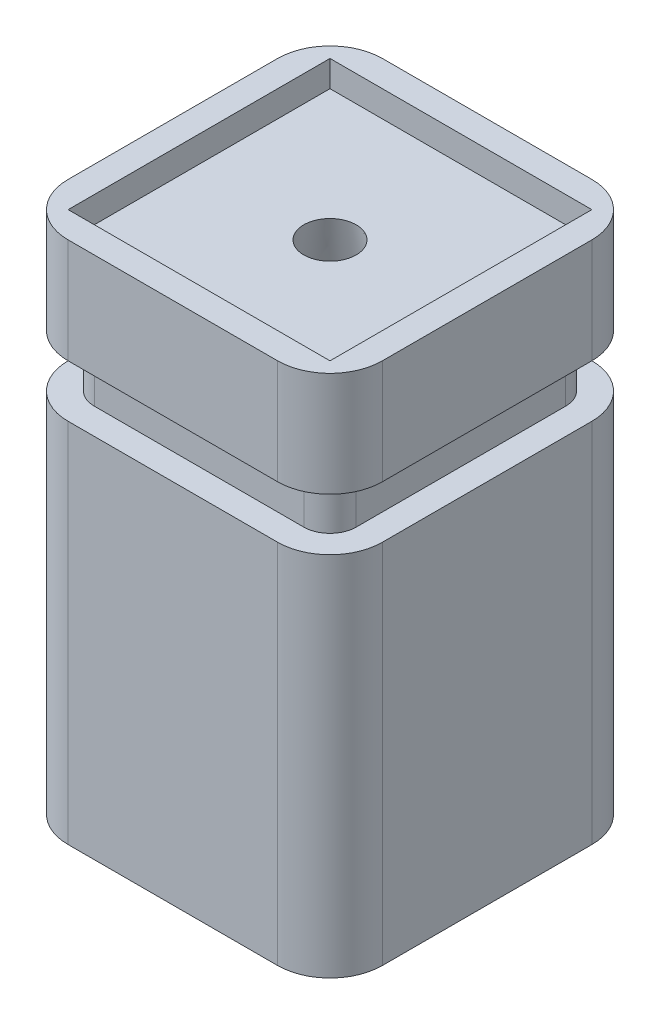
ISO-10303-21;
HEADER;
FILE_DESCRIPTION(('STEP AP214'),'2;1');
FILE_NAME('part.step','',(''),(''),'','','');
FILE_SCHEMA(('AUTOMOTIVE_DESIGN { 1 0 10303 214 1 1 1 1 }'));
ENDSEC;
DATA;
#1=APPLICATION_CONTEXT('core data for automotive mechanical design processes');
#2=APPLICATION_PROTOCOL_DEFINITION('international standard','automotive_design',2000,#1);
#3=PRODUCT_CONTEXT('',#1,'mechanical');
#4=PRODUCT('Part','Part','',(#3));
#5=PRODUCT_RELATED_PRODUCT_CATEGORY('part','',(#4));
#6=PRODUCT_DEFINITION_FORMATION('','',#4);
#7=PRODUCT_DEFINITION_CONTEXT('part definition',#1,'design');
#8=PRODUCT_DEFINITION('design','',#6,#7);
#9=PRODUCT_DEFINITION_SHAPE('','',#8);
#10=(LENGTH_UNIT() NAMED_UNIT(*) SI_UNIT(.MILLI.,.METRE.));
#11=(NAMED_UNIT(*) PLANE_ANGLE_UNIT() SI_UNIT($,.RADIAN.));
#12=(NAMED_UNIT(*) SI_UNIT($,.STERADIAN.) SOLID_ANGLE_UNIT());
#13=UNCERTAINTY_MEASURE_WITH_UNIT(LENGTH_MEASURE(1.E-05),#10,'distance_accuracy_value','');
#14=(GEOMETRIC_REPRESENTATION_CONTEXT(3) GLOBAL_UNCERTAINTY_ASSIGNED_CONTEXT((#13)) GLOBAL_UNIT_ASSIGNED_CONTEXT((#10,
#11,#12)) REPRESENTATION_CONTEXT('',''));
#15=CARTESIAN_POINT('',(0.,0.,0.));
#16=DIRECTION('',(0.,0.,1.));
#17=DIRECTION('',(1.,0.,0.));
#18=AXIS2_PLACEMENT_3D('',#15,#16,#17);
#19=CARTESIAN_POINT('',(15.,50.,15.));
#20=DIRECTION('',(-1.,0.,0.));
#21=DIRECTION('',(0.,0.,1.));
#22=AXIS2_PLACEMENT_3D('',#19,#20,#21);
#23=PLANE('',#22);
#24=DIRECTION('',(0.,0.,-1.));
#25=VECTOR('',#24,1.);
#26=CARTESIAN_POINT('',(15.,35.,15.));
#27=LINE('',#26,#25);
#28=CARTESIAN_POINT('',(15.,35.,10.));
#29=VERTEX_POINT('',#28);
#30=CARTESIAN_POINT('',(15.,35.,-9.99999999999999));
#31=VERTEX_POINT('',#30);
#32=EDGE_CURVE('E306',#29,#31,#27,.T.);
#33=ORIENTED_EDGE('',*,*,#32,.F.);
#34=DIRECTION('',(0.,-1.,0.));
#35=VECTOR('',#34,1.);
#36=CARTESIAN_POINT('',(15.,50.,10.));
#37=LINE('',#36,#35);
#38=CARTESIAN_POINT('',(15.,0.,10.));
#39=VERTEX_POINT('',#38);
#40=EDGE_CURVE('E405',#29,#39,#37,.T.);
#41=ORIENTED_EDGE('',*,*,#40,.T.);
#42=DIRECTION('',(0.,0.,-1.));
#43=VECTOR('',#42,1.);
#44=CARTESIAN_POINT('',(15.,0.,15.));
#45=LINE('',#44,#43);
#46=CARTESIAN_POINT('',(15.,0.,-10.));
#47=VERTEX_POINT('',#46);
#48=EDGE_CURVE('E359',#39,#47,#45,.T.);
#49=ORIENTED_EDGE('',*,*,#48,.T.);
#50=DIRECTION('',(0.,-1.,0.));
#51=VECTOR('',#50,1.);
#52=CARTESIAN_POINT('',(15.,50.,-10.));
#53=LINE('',#52,#51);
#54=EDGE_CURVE('E410',#47,#31,#53,.F.);
#55=ORIENTED_EDGE('',*,*,#54,.T.);
#56=EDGE_LOOP('',(#33,#41,#49,#55));
#57=FACE_BOUND('',#56,.T.);
#58=ADVANCED_FACE('F41',(#57),#23,.F.);
#59=CARTESIAN_POINT('',(-15.,50.,-15.));
#60=DIRECTION('',(0.,0.,1.));
#61=DIRECTION('',(1.,0.,0.));
#62=AXIS2_PLACEMENT_3D('',#59,#60,#61);
#63=PLANE('',#62);
#64=DIRECTION('',(-1.,0.,0.));
#65=VECTOR('',#64,1.);
#66=CARTESIAN_POINT('',(-15.,35.,-15.));
#67=LINE('',#66,#65);
#68=CARTESIAN_POINT('',(9.99999999999999,35.,-15.));
#69=VERTEX_POINT('',#68);
#70=CARTESIAN_POINT('',(-10.,35.,-15.));
#71=VERTEX_POINT('',#70);
#72=EDGE_CURVE('E304',#69,#71,#67,.T.);
#73=ORIENTED_EDGE('',*,*,#72,.F.);
#74=DIRECTION('',(0.,-1.,0.));
#75=VECTOR('',#74,1.);
#76=CARTESIAN_POINT('',(10.,50.,-15.));
#77=LINE('',#76,#75);
#78=CARTESIAN_POINT('',(10.,0.,-15.));
#79=VERTEX_POINT('',#78);
#80=EDGE_CURVE('E393',#69,#79,#77,.T.);
#81=ORIENTED_EDGE('',*,*,#80,.T.);
#82=DIRECTION('',(-1.,0.,0.));
#83=VECTOR('',#82,1.);
#84=CARTESIAN_POINT('',(-15.,0.,-15.));
#85=LINE('',#84,#83);
#86=CARTESIAN_POINT('',(-10.,0.,-15.));
#87=VERTEX_POINT('',#86);
#88=EDGE_CURVE('E382',#79,#87,#85,.T.);
#89=ORIENTED_EDGE('',*,*,#88,.T.);
#90=DIRECTION('',(0.,-1.,0.));
#91=VECTOR('',#90,1.);
#92=CARTESIAN_POINT('',(-10.,50.,-15.));
#93=LINE('',#92,#91);
#94=EDGE_CURVE('E390',#87,#71,#93,.F.);
#95=ORIENTED_EDGE('',*,*,#94,.T.);
#96=EDGE_LOOP('',(#73,#81,#89,#95));
#97=FACE_BOUND('',#96,.T.);
#98=ADVANCED_FACE('F470',(#97),#63,.F.);
#99=CARTESIAN_POINT('',(-15.,50.,15.));
#100=DIRECTION('',(1.,0.,0.));
#101=DIRECTION('',(0.,0.,-1.));
#102=AXIS2_PLACEMENT_3D('',#99,#100,#101);
#103=PLANE('',#102);
#104=DIRECTION('',(0.,0.,1.));
#105=VECTOR('',#104,1.);
#106=CARTESIAN_POINT('',(-15.,35.,15.));
#107=LINE('',#106,#105);
#108=CARTESIAN_POINT('',(-15.,35.,-9.99999999999999));
#109=VERTEX_POINT('',#108);
#110=CARTESIAN_POINT('',(-15.,35.,10.));
#111=VERTEX_POINT('',#110);
#112=EDGE_CURVE('E63',#109,#111,#107,.T.);
#113=ORIENTED_EDGE('',*,*,#112,.F.);
#114=DIRECTION('',(0.,-1.,0.));
#115=VECTOR('',#114,1.);
#116=CARTESIAN_POINT('',(-15.,50.,-10.));
#117=LINE('',#116,#115);
#118=CARTESIAN_POINT('',(-15.,0.,-10.));
#119=VERTEX_POINT('',#118);
#120=EDGE_CURVE('E433',#109,#119,#117,.T.);
#121=ORIENTED_EDGE('',*,*,#120,.T.);
#122=DIRECTION('',(0.,0.,1.));
#123=VECTOR('',#122,1.);
#124=CARTESIAN_POINT('',(-15.,0.,15.));
#125=LINE('',#124,#123);
#126=CARTESIAN_POINT('',(-15.,0.,10.));
#127=VERTEX_POINT('',#126);
#128=EDGE_CURVE('E385',#119,#127,#125,.T.);
#129=ORIENTED_EDGE('',*,*,#128,.T.);
#130=DIRECTION('',(0.,-1.,0.));
#131=VECTOR('',#130,1.);
#132=CARTESIAN_POINT('',(-15.,50.,10.));
#133=LINE('',#132,#131);
#134=EDGE_CURVE('E430',#127,#111,#133,.F.);
#135=ORIENTED_EDGE('',*,*,#134,.T.);
#136=EDGE_LOOP('',(#113,#121,#129,#135));
#137=FACE_BOUND('',#136,.T.);
#138=ADVANCED_FACE('F443',(#137),#103,.F.);
#139=CARTESIAN_POINT('',(-15.,50.,15.));
#140=DIRECTION('',(0.,0.,-1.));
#141=DIRECTION('',(-1.,0.,0.));
#142=AXIS2_PLACEMENT_3D('',#139,#140,#141);
#143=PLANE('',#142);
#144=DIRECTION('',(1.,0.,0.));
#145=VECTOR('',#144,1.);
#146=CARTESIAN_POINT('',(-15.,35.,15.));
#147=LINE('',#146,#145);
#148=CARTESIAN_POINT('',(-10.,35.,15.));
#149=VERTEX_POINT('',#148);
#150=CARTESIAN_POINT('',(9.99999999999999,35.,15.));
#151=VERTEX_POINT('',#150);
#152=EDGE_CURVE('E245',#149,#151,#147,.T.);
#153=ORIENTED_EDGE('',*,*,#152,.F.);
#154=DIRECTION('',(0.,-1.,0.));
#155=VECTOR('',#154,1.);
#156=CARTESIAN_POINT('',(-10.,50.,15.));
#157=LINE('',#156,#155);
#158=CARTESIAN_POINT('',(-10.,0.,15.));
#159=VERTEX_POINT('',#158);
#160=EDGE_CURVE('E421',#149,#159,#157,.T.);
#161=ORIENTED_EDGE('',*,*,#160,.T.);
#162=DIRECTION('',(1.,0.,0.));
#163=VECTOR('',#162,1.);
#164=CARTESIAN_POINT('',(-15.,0.,15.));
#165=LINE('',#164,#163);
#166=CARTESIAN_POINT('',(10.,0.,15.));
#167=VERTEX_POINT('',#166);
#168=EDGE_CURVE('E370',#159,#167,#165,.T.);
#169=ORIENTED_EDGE('',*,*,#168,.T.);
#170=DIRECTION('',(0.,-1.,0.));
#171=VECTOR('',#170,1.);
#172=CARTESIAN_POINT('',(10.,50.,15.));
#173=LINE('',#172,#171);
#174=EDGE_CURVE('E426',#167,#151,#173,.F.);
#175=ORIENTED_EDGE('',*,*,#174,.T.);
#176=EDGE_LOOP('',(#153,#161,#169,#175));
#177=FACE_BOUND('',#176,.T.);
#178=ADVANCED_FACE('F455',(#177),#143,.F.);
#179=CARTESIAN_POINT('',(10.,50.,-10.));
#180=DIRECTION('',(0.,-1.,0.));
#181=DIRECTION('',(0.,0.,-1.));
#182=AXIS2_PLACEMENT_3D('',#179,#180,#181);
#183=CYLINDRICAL_SURFACE('',#182,5.);
#184=ORIENTED_EDGE('',*,*,#80,.F.);
#185=CARTESIAN_POINT('',(10.,35.,-10.));
#186=DIRECTION('',(0.,1.,0.));
#187=DIRECTION('',(0.,0.,1.));
#188=AXIS2_PLACEMENT_3D('',#185,#186,#187);
#189=CIRCLE('',#188,5.);
#190=EDGE_CURVE('E308',#69,#31,#189,.F.);
#191=ORIENTED_EDGE('',*,*,#190,.T.);
#192=ORIENTED_EDGE('',*,*,#54,.F.);
#193=CARTESIAN_POINT('',(10.,0.,-10.));
#194=DIRECTION('',(0.,-1.,0.));
#195=DIRECTION('',(0.,0.,-1.));
#196=AXIS2_PLACEMENT_3D('',#193,#194,#195);
#197=CIRCLE('',#196,5.);
#198=EDGE_CURVE('E403',#79,#47,#197,.T.);
#199=ORIENTED_EDGE('',*,*,#198,.F.);
#200=EDGE_LOOP('',(#184,#191,#192,#199));
#201=FACE_BOUND('',#200,.T.);
#202=ADVANCED_FACE('F467',(#201),#183,.T.);
#203=CARTESIAN_POINT('',(10.,50.,10.));
#204=DIRECTION('',(0.,-1.,0.));
#205=DIRECTION('',(0.,0.,-1.));
#206=AXIS2_PLACEMENT_3D('',#203,#204,#205);
#207=CYLINDRICAL_SURFACE('',#206,5.);
#208=ORIENTED_EDGE('',*,*,#40,.F.);
#209=CARTESIAN_POINT('',(10.,35.,10.));
#210=DIRECTION('',(0.,1.,0.));
#211=DIRECTION('',(0.,0.,1.));
#212=AXIS2_PLACEMENT_3D('',#209,#210,#211);
#213=CIRCLE('',#212,5.);
#214=EDGE_CURVE('E301',#29,#151,#213,.F.);
#215=ORIENTED_EDGE('',*,*,#214,.T.);
#216=ORIENTED_EDGE('',*,*,#174,.F.);
#217=CARTESIAN_POINT('',(10.,0.,10.));
#218=DIRECTION('',(0.,-1.,0.));
#219=DIRECTION('',(0.,0.,-1.));
#220=AXIS2_PLACEMENT_3D('',#217,#218,#219);
#221=CIRCLE('',#220,5.);
#222=EDGE_CURVE('E401',#39,#167,#221,.T.);
#223=ORIENTED_EDGE('',*,*,#222,.F.);
#224=EDGE_LOOP('',(#208,#215,#216,#223));
#225=FACE_BOUND('',#224,.T.);
#226=ADVANCED_FACE('F458',(#225),#207,.T.);
#227=CARTESIAN_POINT('',(-10.,50.,-10.));
#228=DIRECTION('',(0.,-1.,0.));
#229=DIRECTION('',(0.,0.,-1.));
#230=AXIS2_PLACEMENT_3D('',#227,#228,#229);
#231=CYLINDRICAL_SURFACE('',#230,5.);
#232=ORIENTED_EDGE('',*,*,#120,.F.);
#233=CARTESIAN_POINT('',(-10.,35.,-10.));
#234=DIRECTION('',(0.,1.,0.));
#235=DIRECTION('',(0.,0.,1.));
#236=AXIS2_PLACEMENT_3D('',#233,#234,#235);
#237=CIRCLE('',#236,5.);
#238=EDGE_CURVE('E298',#109,#71,#237,.F.);
#239=ORIENTED_EDGE('',*,*,#238,.T.);
#240=ORIENTED_EDGE('',*,*,#94,.F.);
#241=CARTESIAN_POINT('',(-10.,0.,-10.));
#242=DIRECTION('',(0.,-1.,0.));
#243=DIRECTION('',(0.,0.,-1.));
#244=AXIS2_PLACEMENT_3D('',#241,#242,#243);
#245=CIRCLE('',#244,5.);
#246=EDGE_CURVE('E399',#119,#87,#245,.T.);
#247=ORIENTED_EDGE('',*,*,#246,.F.);
#248=EDGE_LOOP('',(#232,#239,#240,#247));
#249=FACE_BOUND('',#248,.T.);
#250=ADVANCED_FACE('F473',(#249),#231,.T.);
#251=CARTESIAN_POINT('',(-10.,50.,10.));
#252=DIRECTION('',(0.,-1.,0.));
#253=DIRECTION('',(0.,0.,-1.));
#254=AXIS2_PLACEMENT_3D('',#251,#252,#253);
#255=CYLINDRICAL_SURFACE('',#254,5.);
#256=ORIENTED_EDGE('',*,*,#160,.F.);
#257=CARTESIAN_POINT('',(-10.,35.,10.));
#258=DIRECTION('',(0.,1.,0.));
#259=DIRECTION('',(0.,0.,1.));
#260=AXIS2_PLACEMENT_3D('',#257,#258,#259);
#261=CIRCLE('',#260,5.);
#262=EDGE_CURVE('E49',#149,#111,#261,.F.);
#263=ORIENTED_EDGE('',*,*,#262,.T.);
#264=ORIENTED_EDGE('',*,*,#134,.F.);
#265=CARTESIAN_POINT('',(-10.,0.,10.));
#266=DIRECTION('',(0.,-1.,0.));
#267=DIRECTION('',(0.,0.,-1.));
#268=AXIS2_PLACEMENT_3D('',#265,#266,#267);
#269=CIRCLE('',#268,5.);
#270=EDGE_CURVE('E397',#159,#127,#269,.T.);
#271=ORIENTED_EDGE('',*,*,#270,.F.);
#272=EDGE_LOOP('',(#256,#263,#264,#271));
#273=FACE_BOUND('',#272,.T.);
#274=ADVANCED_FACE('F439',(#273),#255,.T.);
#275=CARTESIAN_POINT('',(0.,47.5,0.));
#276=DIRECTION('',(0.,-1.,0.));
#277=DIRECTION('',(0.,0.,-1.));
#278=AXIS2_PLACEMENT_3D('',#275,#276,#277);
#279=PLANE('',#278);
#280=DIRECTION('',(0.,0.,-1.));
#281=VECTOR('',#280,1.);
#282=CARTESIAN_POINT('',(12.5,47.5,12.5));
#283=LINE('',#282,#281);
#284=CARTESIAN_POINT('',(12.5,47.5,12.5));
#285=VERTEX_POINT('',#284);
#286=CARTESIAN_POINT('',(12.5,47.5,-12.5));
#287=VERTEX_POINT('',#286);
#288=EDGE_CURVE('E334',#285,#287,#283,.T.);
#289=ORIENTED_EDGE('',*,*,#288,.T.);
#290=DIRECTION('',(-1.,0.,0.));
#291=VECTOR('',#290,1.);
#292=CARTESIAN_POINT('',(-12.5,47.5,-12.5));
#293=LINE('',#292,#291);
#294=CARTESIAN_POINT('',(-12.5,47.5,-12.5));
#295=VERTEX_POINT('',#294);
#296=EDGE_CURVE('E337',#287,#295,#293,.T.);
#297=ORIENTED_EDGE('',*,*,#296,.T.);
#298=DIRECTION('',(0.,0.,1.));
#299=VECTOR('',#298,1.);
#300=CARTESIAN_POINT('',(-12.5,47.5,12.5));
#301=LINE('',#300,#299);
#302=CARTESIAN_POINT('',(-12.5,47.5,12.5));
#303=VERTEX_POINT('',#302);
#304=EDGE_CURVE('E341',#295,#303,#301,.T.);
#305=ORIENTED_EDGE('',*,*,#304,.T.);
#306=DIRECTION('',(1.,0.,0.));
#307=VECTOR('',#306,1.);
#308=CARTESIAN_POINT('',(-12.5,47.5,12.5));
#309=LINE('',#308,#307);
#310=EDGE_CURVE('E344',#303,#285,#309,.T.);
#311=ORIENTED_EDGE('',*,*,#310,.T.);
#312=EDGE_LOOP('',(#289,#297,#305,#311));
#313=FACE_BOUND('',#312,.T.);
#314=CARTESIAN_POINT('',(0.,47.5,0.));
#315=DIRECTION('',(0.,1.,0.));
#316=DIRECTION('',(0.,0.,1.));
#317=AXIS2_PLACEMENT_3D('',#314,#315,#316);
#318=CIRCLE('',#317,2.5);
#319=CARTESIAN_POINT('',(0.784484004687969,47.5,-2.37372804811097));
#320=VERTEX_POINT('',#319);
#321=EDGE_CURVE('E330',#320,#320,#318,.T.);
#322=ORIENTED_EDGE('',*,*,#321,.F.);
#323=EDGE_LOOP('',(#322));
#324=FACE_BOUND('',#323,.T.);
#325=ADVANCED_FACE('F480',(#313,#324),#279,.F.);
#326=CARTESIAN_POINT('',(15.,50.,10.));
#327=VERTEX_POINT('',#326);
#328=CARTESIAN_POINT('',(15.,40.,10.));
#329=VERTEX_POINT('',#328);
#330=EDGE_CURVE('E406',#327,#329,#37,.T.);
#331=ORIENTED_EDGE('',*,*,#330,.T.);
#332=DIRECTION('',(0.,0.,-1.));
#333=VECTOR('',#332,1.);
#334=CARTESIAN_POINT('',(15.,40.,15.));
#335=LINE('',#334,#333);
#336=CARTESIAN_POINT('',(15.,40.,-9.99999999999999));
#337=VERTEX_POINT('',#336);
#338=EDGE_CURVE('E322',#329,#337,#335,.T.);
#339=ORIENTED_EDGE('',*,*,#338,.T.);
#340=CARTESIAN_POINT('',(15.,50.,-10.));
#341=VERTEX_POINT('',#340);
#342=EDGE_CURVE('E409',#337,#341,#53,.F.);
#343=ORIENTED_EDGE('',*,*,#342,.T.);
#344=DIRECTION('',(0.,0.,-1.));
#345=VECTOR('',#344,1.);
#346=CARTESIAN_POINT('',(15.,50.,15.));
#347=LINE('',#346,#345);
#348=EDGE_CURVE('E366',#327,#341,#347,.T.);
#349=ORIENTED_EDGE('',*,*,#348,.F.);
#350=EDGE_LOOP('',(#331,#339,#343,#349));
#351=FACE_BOUND('',#350,.T.);
#352=ADVANCED_FACE('F487',(#351),#23,.F.);
#353=CARTESIAN_POINT('',(10.,50.,-15.));
#354=VERTEX_POINT('',#353);
#355=CARTESIAN_POINT('',(9.99999999999999,40.,-15.));
#356=VERTEX_POINT('',#355);
#357=EDGE_CURVE('E394',#354,#356,#77,.T.);
#358=ORIENTED_EDGE('',*,*,#357,.T.);
#359=DIRECTION('',(-1.,0.,0.));
#360=VECTOR('',#359,1.);
#361=CARTESIAN_POINT('',(-15.,40.,-15.));
#362=LINE('',#361,#360);
#363=CARTESIAN_POINT('',(-10.,40.,-15.));
#364=VERTEX_POINT('',#363);
#365=EDGE_CURVE('E319',#356,#364,#362,.T.);
#366=ORIENTED_EDGE('',*,*,#365,.T.);
#367=CARTESIAN_POINT('',(-10.,50.,-15.));
#368=VERTEX_POINT('',#367);
#369=EDGE_CURVE('E379',#364,#368,#93,.F.);
#370=ORIENTED_EDGE('',*,*,#369,.T.);
#371=DIRECTION('',(-1.,0.,0.));
#372=VECTOR('',#371,1.);
#373=CARTESIAN_POINT('',(-15.,50.,-15.));
#374=LINE('',#373,#372);
#375=EDGE_CURVE('E369',#354,#368,#374,.T.);
#376=ORIENTED_EDGE('',*,*,#375,.F.);
#377=EDGE_LOOP('',(#358,#366,#370,#376));
#378=FACE_BOUND('',#377,.T.);
#379=ADVANCED_FACE('F493',(#378),#63,.F.);
#380=CARTESIAN_POINT('',(-15.,50.,-10.));
#381=VERTEX_POINT('',#380);
#382=CARTESIAN_POINT('',(-15.,40.,-9.99999999999999));
#383=VERTEX_POINT('',#382);
#384=EDGE_CURVE('E434',#381,#383,#117,.T.);
#385=ORIENTED_EDGE('',*,*,#384,.T.);
#386=DIRECTION('',(0.,0.,1.));
#387=VECTOR('',#386,1.);
#388=CARTESIAN_POINT('',(-15.,40.,15.));
#389=LINE('',#388,#387);
#390=CARTESIAN_POINT('',(-15.,40.,10.));
#391=VERTEX_POINT('',#390);
#392=EDGE_CURVE('E312',#383,#391,#389,.T.);
#393=ORIENTED_EDGE('',*,*,#392,.T.);
#394=CARTESIAN_POINT('',(-15.,50.,10.));
#395=VERTEX_POINT('',#394);
#396=EDGE_CURVE('E429',#391,#395,#133,.F.);
#397=ORIENTED_EDGE('',*,*,#396,.T.);
#398=DIRECTION('',(0.,0.,1.));
#399=VECTOR('',#398,1.);
#400=CARTESIAN_POINT('',(-15.,50.,15.));
#401=LINE('',#400,#399);
#402=EDGE_CURVE('E373',#381,#395,#401,.T.);
#403=ORIENTED_EDGE('',*,*,#402,.F.);
#404=EDGE_LOOP('',(#385,#393,#397,#403));
#405=FACE_BOUND('',#404,.T.);
#406=ADVANCED_FACE('F500',(#405),#103,.F.);
#407=CARTESIAN_POINT('',(-10.,50.,15.));
#408=VERTEX_POINT('',#407);
#409=CARTESIAN_POINT('',(-10.,40.,15.));
#410=VERTEX_POINT('',#409);
#411=EDGE_CURVE('E422',#408,#410,#157,.T.);
#412=ORIENTED_EDGE('',*,*,#411,.T.);
#413=DIRECTION('',(1.,0.,0.));
#414=VECTOR('',#413,1.);
#415=CARTESIAN_POINT('',(-15.,40.,15.));
#416=LINE('',#415,#414);
#417=CARTESIAN_POINT('',(9.99999999999999,40.,15.));
#418=VERTEX_POINT('',#417);
#419=EDGE_CURVE('E55',#410,#418,#416,.T.);
#420=ORIENTED_EDGE('',*,*,#419,.T.);
#421=CARTESIAN_POINT('',(10.,50.,15.));
#422=VERTEX_POINT('',#421);
#423=EDGE_CURVE('E425',#418,#422,#173,.F.);
#424=ORIENTED_EDGE('',*,*,#423,.T.);
#425=DIRECTION('',(1.,0.,0.));
#426=VECTOR('',#425,1.);
#427=CARTESIAN_POINT('',(-15.,50.,15.));
#428=LINE('',#427,#426);
#429=EDGE_CURVE('E376',#408,#422,#428,.T.);
#430=ORIENTED_EDGE('',*,*,#429,.F.);
#431=EDGE_LOOP('',(#412,#420,#424,#430));
#432=FACE_BOUND('',#431,.T.);
#433=ADVANCED_FACE('F513',(#432),#143,.F.);
#434=CARTESIAN_POINT('',(0.,50.,0.));
#435=DIRECTION('',(0.,-1.,0.));
#436=DIRECTION('',(0.,0.,-1.));
#437=AXIS2_PLACEMENT_3D('',#434,#435,#436);
#438=PLANE('',#437);
#439=DIRECTION('',(-1.,0.,0.));
#440=VECTOR('',#439,1.);
#441=CARTESIAN_POINT('',(-12.5,50.,-12.5));
#442=LINE('',#441,#440);
#443=CARTESIAN_POINT('',(12.5,50.,-12.5));
#444=VERTEX_POINT('',#443);
#445=CARTESIAN_POINT('',(-12.5,50.,-12.5));
#446=VERTEX_POINT('',#445);
#447=EDGE_CURVE('E349',#444,#446,#442,.T.);
#448=ORIENTED_EDGE('',*,*,#447,.F.);
#449=DIRECTION('',(0.,0.,-1.));
#450=VECTOR('',#449,1.);
#451=CARTESIAN_POINT('',(12.5,50.,12.5));
#452=LINE('',#451,#450);
#453=CARTESIAN_POINT('',(12.5,50.,12.5));
#454=VERTEX_POINT('',#453);
#455=EDGE_CURVE('E333',#454,#444,#452,.T.);
#456=ORIENTED_EDGE('',*,*,#455,.F.);
#457=DIRECTION('',(1.,0.,0.));
#458=VECTOR('',#457,1.);
#459=CARTESIAN_POINT('',(-12.5,50.,12.5));
#460=LINE('',#459,#458);
#461=CARTESIAN_POINT('',(-12.5,50.,12.5));
#462=VERTEX_POINT('',#461);
#463=EDGE_CURVE('E338',#462,#454,#460,.T.);
#464=ORIENTED_EDGE('',*,*,#463,.F.);
#465=DIRECTION('',(0.,0.,1.));
#466=VECTOR('',#465,1.);
#467=CARTESIAN_POINT('',(-12.5,50.,12.5));
#468=LINE('',#467,#466);
#469=EDGE_CURVE('E352',#446,#462,#468,.T.);
#470=ORIENTED_EDGE('',*,*,#469,.F.);
#471=EDGE_LOOP('',(#448,#456,#464,#470));
#472=FACE_BOUND('',#471,.T.);
#473=ORIENTED_EDGE('',*,*,#348,.T.);
#474=CARTESIAN_POINT('',(10.,50.,-10.));
#475=DIRECTION('',(0.,-1.,0.));
#476=DIRECTION('',(0.,0.,-1.));
#477=AXIS2_PLACEMENT_3D('',#474,#475,#476);
#478=CIRCLE('',#477,5.);
#479=EDGE_CURVE('E419',#341,#354,#478,.F.);
#480=ORIENTED_EDGE('',*,*,#479,.T.);
#481=ORIENTED_EDGE('',*,*,#375,.T.);
#482=CARTESIAN_POINT('',(-10.,50.,-10.));
#483=DIRECTION('',(0.,-1.,0.));
#484=DIRECTION('',(0.,0.,-1.));
#485=AXIS2_PLACEMENT_3D('',#482,#483,#484);
#486=CIRCLE('',#485,5.);
#487=EDGE_CURVE('E415',#368,#381,#486,.F.);
#488=ORIENTED_EDGE('',*,*,#487,.T.);
#489=ORIENTED_EDGE('',*,*,#402,.T.);
#490=CARTESIAN_POINT('',(-10.,50.,10.));
#491=DIRECTION('',(0.,-1.,0.));
#492=DIRECTION('',(0.,0.,-1.));
#493=AXIS2_PLACEMENT_3D('',#490,#491,#492);
#494=CIRCLE('',#493,5.);
#495=EDGE_CURVE('E413',#395,#408,#494,.F.);
#496=ORIENTED_EDGE('',*,*,#495,.T.);
#497=ORIENTED_EDGE('',*,*,#429,.T.);
#498=CARTESIAN_POINT('',(10.,50.,10.));
#499=DIRECTION('',(0.,-1.,0.));
#500=DIRECTION('',(0.,0.,-1.));
#501=AXIS2_PLACEMENT_3D('',#498,#499,#500);
#502=CIRCLE('',#501,5.);
#503=EDGE_CURVE('E417',#422,#327,#502,.F.);
#504=ORIENTED_EDGE('',*,*,#503,.T.);
#505=EDGE_LOOP('',(#473,#480,#481,#488,#489,#496,#497,#504));
#506=FACE_BOUND('',#505,.T.);
#507=ADVANCED_FACE('F532',(#472,#506),#438,.F.);
#508=CARTESIAN_POINT('',(0.,0.,0.));
#509=DIRECTION('',(0.,-1.,0.));
#510=DIRECTION('',(0.,0.,-1.));
#511=AXIS2_PLACEMENT_3D('',#508,#509,#510);
#512=PLANE('',#511);
#513=CARTESIAN_POINT('',(0.,0.,0.));
#514=DIRECTION('',(0.,-1.,0.));
#515=DIRECTION('',(0.,0.,-1.));
#516=AXIS2_PLACEMENT_3D('',#513,#514,#515);
#517=CIRCLE('',#516,12.5);
#518=CARTESIAN_POINT('',(0.,0.,-12.5));
#519=VERTEX_POINT('',#518);
#520=EDGE_CURVE('E327',#519,#519,#517,.T.);
#521=ORIENTED_EDGE('',*,*,#520,.F.);
#522=EDGE_LOOP('',(#521));
#523=FACE_BOUND('',#522,.T.);
#524=ORIENTED_EDGE('',*,*,#88,.F.);
#525=ORIENTED_EDGE('',*,*,#198,.T.);
#526=ORIENTED_EDGE('',*,*,#48,.F.);
#527=ORIENTED_EDGE('',*,*,#222,.T.);
#528=ORIENTED_EDGE('',*,*,#168,.F.);
#529=ORIENTED_EDGE('',*,*,#270,.T.);
#530=ORIENTED_EDGE('',*,*,#128,.F.);
#531=ORIENTED_EDGE('',*,*,#246,.T.);
#532=EDGE_LOOP('',(#524,#525,#526,#527,#528,#529,#530,#531));
#533=FACE_BOUND('',#532,.T.);
#534=ADVANCED_FACE('F449',(#523,#533),#512,.T.);
#535=CARTESIAN_POINT('',(12.5,47.5,12.5));
#536=DIRECTION('',(1.,0.,0.));
#537=DIRECTION('',(0.,0.,-1.));
#538=AXIS2_PLACEMENT_3D('',#535,#536,#537);
#539=PLANE('',#538);
#540=ORIENTED_EDGE('',*,*,#455,.T.);
#541=DIRECTION('',(0.,1.,0.));
#542=VECTOR('',#541,1.);
#543=CARTESIAN_POINT('',(12.5,47.5,-12.5));
#544=LINE('',#543,#542);
#545=EDGE_CURVE('E347',#287,#444,#544,.T.);
#546=ORIENTED_EDGE('',*,*,#545,.F.);
#547=ORIENTED_EDGE('',*,*,#288,.F.);
#548=DIRECTION('',(0.,1.,0.));
#549=VECTOR('',#548,1.);
#550=CARTESIAN_POINT('',(12.5,47.5,12.5));
#551=LINE('',#550,#549);
#552=EDGE_CURVE('E357',#285,#454,#551,.T.);
#553=ORIENTED_EDGE('',*,*,#552,.T.);
#554=EDGE_LOOP('',(#540,#546,#547,#553));
#555=FACE_BOUND('',#554,.T.);
#556=ADVANCED_FACE('F540',(#555),#539,.F.);
#557=CARTESIAN_POINT('',(-12.5,47.5,12.5));
#558=DIRECTION('',(0.,0.,1.));
#559=DIRECTION('',(1.,0.,0.));
#560=AXIS2_PLACEMENT_3D('',#557,#558,#559);
#561=PLANE('',#560);
#562=ORIENTED_EDGE('',*,*,#463,.T.);
#563=ORIENTED_EDGE('',*,*,#552,.F.);
#564=ORIENTED_EDGE('',*,*,#310,.F.);
#565=DIRECTION('',(0.,1.,0.));
#566=VECTOR('',#565,1.);
#567=CARTESIAN_POINT('',(-12.5,47.5,12.5));
#568=LINE('',#567,#566);
#569=EDGE_CURVE('E360',#303,#462,#568,.T.);
#570=ORIENTED_EDGE('',*,*,#569,.T.);
#571=EDGE_LOOP('',(#562,#563,#564,#570));
#572=FACE_BOUND('',#571,.T.);
#573=ADVANCED_FACE('F571',(#572),#561,.F.);
#574=CARTESIAN_POINT('',(-12.5,47.5,12.5));
#575=DIRECTION('',(-1.,0.,0.));
#576=DIRECTION('',(0.,0.,1.));
#577=AXIS2_PLACEMENT_3D('',#574,#575,#576);
#578=PLANE('',#577);
#579=ORIENTED_EDGE('',*,*,#469,.T.);
#580=ORIENTED_EDGE('',*,*,#569,.F.);
#581=ORIENTED_EDGE('',*,*,#304,.F.);
#582=DIRECTION('',(0.,1.,0.));
#583=VECTOR('',#582,1.);
#584=CARTESIAN_POINT('',(-12.5,47.5,-12.5));
#585=LINE('',#584,#583);
#586=EDGE_CURVE('E362',#295,#446,#585,.T.);
#587=ORIENTED_EDGE('',*,*,#586,.T.);
#588=EDGE_LOOP('',(#579,#580,#581,#587));
#589=FACE_BOUND('',#588,.T.);
#590=ADVANCED_FACE('F566',(#589),#578,.F.);
#591=CARTESIAN_POINT('',(-12.5,47.5,-12.5));
#592=DIRECTION('',(0.,0.,-1.));
#593=DIRECTION('',(-1.,0.,0.));
#594=AXIS2_PLACEMENT_3D('',#591,#592,#593);
#595=PLANE('',#594);
#596=ORIENTED_EDGE('',*,*,#447,.T.);
#597=ORIENTED_EDGE('',*,*,#586,.F.);
#598=ORIENTED_EDGE('',*,*,#296,.F.);
#599=ORIENTED_EDGE('',*,*,#545,.T.);
#600=EDGE_LOOP('',(#596,#597,#598,#599));
#601=FACE_BOUND('',#600,.T.);
#602=ADVANCED_FACE('F562',(#601),#595,.F.);
#603=CARTESIAN_POINT('',(10.,40.,-10.));
#604=DIRECTION('',(0.,1.,0.));
#605=DIRECTION('',(0.,0.,1.));
#606=AXIS2_PLACEMENT_3D('',#603,#604,#605);
#607=CIRCLE('',#606,5.);
#608=EDGE_CURVE('E325',#356,#337,#607,.F.);
#609=ORIENTED_EDGE('',*,*,#608,.F.);
#610=ORIENTED_EDGE('',*,*,#357,.F.);
#611=ORIENTED_EDGE('',*,*,#479,.F.);
#612=ORIENTED_EDGE('',*,*,#342,.F.);
#613=EDGE_LOOP('',(#609,#610,#611,#612));
#614=FACE_BOUND('',#613,.T.);
#615=ADVANCED_FACE('F530',(#614),#183,.T.);
#616=CARTESIAN_POINT('',(10.,40.,10.));
#617=DIRECTION('',(0.,1.,0.));
#618=DIRECTION('',(0.,0.,1.));
#619=AXIS2_PLACEMENT_3D('',#616,#617,#618);
#620=CIRCLE('',#619,5.);
#621=EDGE_CURVE('E317',#329,#418,#620,.F.);
#622=ORIENTED_EDGE('',*,*,#621,.F.);
#623=ORIENTED_EDGE('',*,*,#330,.F.);
#624=ORIENTED_EDGE('',*,*,#503,.F.);
#625=ORIENTED_EDGE('',*,*,#423,.F.);
#626=EDGE_LOOP('',(#622,#623,#624,#625));
#627=FACE_BOUND('',#626,.T.);
#628=ADVANCED_FACE('F482',(#627),#207,.T.);
#629=CARTESIAN_POINT('',(-10.,40.,-10.));
#630=DIRECTION('',(0.,1.,0.));
#631=DIRECTION('',(0.,0.,1.));
#632=AXIS2_PLACEMENT_3D('',#629,#630,#631);
#633=CIRCLE('',#632,5.);
#634=EDGE_CURVE('E315',#383,#364,#633,.F.);
#635=ORIENTED_EDGE('',*,*,#634,.F.);
#636=ORIENTED_EDGE('',*,*,#384,.F.);
#637=ORIENTED_EDGE('',*,*,#487,.F.);
#638=ORIENTED_EDGE('',*,*,#369,.F.);
#639=EDGE_LOOP('',(#635,#636,#637,#638));
#640=FACE_BOUND('',#639,.T.);
#641=ADVANCED_FACE('F475',(#640),#231,.T.);
#642=CARTESIAN_POINT('',(-10.,40.,10.));
#643=DIRECTION('',(0.,1.,0.));
#644=DIRECTION('',(0.,0.,1.));
#645=AXIS2_PLACEMENT_3D('',#642,#643,#644);
#646=CIRCLE('',#645,5.);
#647=EDGE_CURVE('E12',#410,#391,#646,.F.);
#648=ORIENTED_EDGE('',*,*,#647,.F.);
#649=ORIENTED_EDGE('',*,*,#411,.F.);
#650=ORIENTED_EDGE('',*,*,#495,.F.);
#651=ORIENTED_EDGE('',*,*,#396,.F.);
#652=EDGE_LOOP('',(#648,#649,#650,#651));
#653=FACE_BOUND('',#652,.T.);
#654=ADVANCED_FACE('F43',(#653),#255,.T.);
#655=CARTESIAN_POINT('',(0.,0.,-12.5));
#656=CARTESIAN_POINT('',(0.784484004687969,47.5,-2.37372804811097));
#657=CARTESIAN_POINT('',(-25.,0.,-12.5));
#658=CARTESIAN_POINT('',(-3.96297209153398,47.5,-3.94269605748691));
#659=CARTESIAN_POINT('',(-25.,0.,12.5));
#660=CARTESIAN_POINT('',(-5.53194010090991,47.5,0.804760038735037));
#661=CARTESIAN_POINT('',(0.,0.,12.5));
#662=CARTESIAN_POINT('',(-0.784484004687968,47.5,2.37372804811097));
#663=CARTESIAN_POINT('',(25.,0.,12.5));
#664=CARTESIAN_POINT('',(3.96297209153398,47.5,3.94269605748691));
#665=CARTESIAN_POINT('',(25.,0.,-12.5));
#666=CARTESIAN_POINT('',(5.53194010090991,47.5,-0.804760038735038));
#667=CARTESIAN_POINT('',(0.,0.,-12.5));
#668=CARTESIAN_POINT('',(0.784484004687969,47.5,-2.37372804811097));
#669=(BOUNDED_SURFACE() B_SPLINE_SURFACE(3,1,((#655,#656),(#657,#658),(#659,#660),(#661,#662),
(#663,#664),(#665,#666),(#667,#668)),.UNSPECIFIED.,.T.,.F.,.F.) B_SPLINE_SURFACE_WITH_KNOTS((4,
3,4),(2,2),(0.,0.5,1.),(0.,1.),
.UNSPECIFIED.) GEOMETRIC_REPRESENTATION_ITEM() RATIONAL_B_SPLINE_SURFACE(((1.,1.),
(0.333333333333333,0.333333333333333),(0.333333333333333,0.333333333333333),(1.,1.),
(0.333333333333333,0.333333333333333),(0.333333333333333,0.333333333333333),(1.,1.))) REPRESENTATION_ITEM('') SURFACE());
#670=CARTESIAN_POINT('',(0.,0.,-12.5));
#671=CARTESIAN_POINT('',(0.00817170838216634,0.494791666666667,-12.3945180005012));
#672=CARTESIAN_POINT('',(0.0163434167643327,0.989583333333334,-12.2890360010023));
#673=CARTESIAN_POINT('',(0.0326868335286654,1.97916666666667,-12.0780720020046));
#674=CARTESIAN_POINT('',(0.0408585419108317,2.47395833333333,-11.9725900025058));
#675=CARTESIAN_POINT('',(0.0572019586751644,3.46354166666667,-11.7616260035081));
#676=CARTESIAN_POINT('',(0.0653736670573307,3.95833333333333,-11.6561440040092));
#677=CARTESIAN_POINT('',(0.0817170838216634,4.94791666666667,-11.4451800050116));
#678=CARTESIAN_POINT('',(0.0898887922038297,5.44270833333333,-11.3396980055127));
#679=CARTESIAN_POINT('',(0.106232208968162,6.43229166666667,-11.128734006515));
#680=CARTESIAN_POINT('',(0.114403917350329,6.92708333333333,-11.0232520070162));
#681=CARTESIAN_POINT('',(0.130747334114661,7.91666666666667,-10.8122880080185));
#682=CARTESIAN_POINT('',(0.138919042496828,8.41145833333333,-10.7068060085197));
#683=CARTESIAN_POINT('',(0.15526245926116,9.40104166666667,-10.495842009522));
#684=CARTESIAN_POINT('',(0.163434167643327,9.89583333333333,-10.3903600100231));
#685=CARTESIAN_POINT('',(0.179777584407659,10.8854166666667,-10.1793960110254));
#686=CARTESIAN_POINT('',(0.187949292789826,11.3802083333333,-10.0739140115266));
#687=CARTESIAN_POINT('',(0.204292709554158,12.3697916666667,-9.8629500125289));
#688=CARTESIAN_POINT('',(0.212464417936325,12.8645833333333,-9.75746801303006));
#689=CARTESIAN_POINT('',(0.228807834700657,13.8541666666667,-9.54650401403237));
#690=CARTESIAN_POINT('',(0.236979543082824,14.3489583333333,-9.44102201453352));
#691=CARTESIAN_POINT('',(0.253322959847157,15.3385416666667,-9.23005801553584));
#692=CARTESIAN_POINT('',(0.261494668229323,15.8333333333333,-9.12457601603699));
#693=CARTESIAN_POINT('',(0.277838084993656,16.8229166666667,-8.9136120170393));
#694=CARTESIAN_POINT('',(0.286009793375822,17.3177083333333,-8.80813001754046));
#695=CARTESIAN_POINT('',(0.302353210140155,18.3072916666667,-8.59716601854277));
#696=CARTESIAN_POINT('',(0.310524918522321,18.8020833333333,-8.49168401904393));
#697=CARTESIAN_POINT('',(0.326868335286654,19.7916666666667,-8.28072002004624));
#698=CARTESIAN_POINT('',(0.33504004366882,20.2864583333333,-8.1752380205474));
#699=CARTESIAN_POINT('',(0.351383460433152,21.2760416666667,-7.96427402154971));
#700=CARTESIAN_POINT('',(0.359555168815319,21.7708333333333,-7.85879202205086));
#701=CARTESIAN_POINT('',(0.375898585579652,22.7604166666667,-7.64782802305317));
#702=CARTESIAN_POINT('',(0.384070293961818,23.2552083333333,-7.54234602355433));
#703=CARTESIAN_POINT('',(0.400413710726151,24.2447916666667,-7.33138202455664));
#704=CARTESIAN_POINT('',(0.408585419108317,24.7395833333333,-7.2259000250578));
#705=CARTESIAN_POINT('',(0.42492883587265,25.7291666666667,-7.01493602606011));
#706=CARTESIAN_POINT('',(0.433100544254816,26.2239583333333,-6.90945402656127));
#707=CARTESIAN_POINT('',(0.449443961019149,27.2135416666667,-6.69849002756358));
#708=CARTESIAN_POINT('',(0.457615669401315,27.7083333333333,-6.59300802806473));
#709=CARTESIAN_POINT('',(0.473959086165648,28.6979166666667,-6.38204402906705));
#710=CARTESIAN_POINT('',(0.482130794547814,29.1927083333333,-6.2765620295682));
#711=CARTESIAN_POINT('',(0.498474211312147,30.1822916666667,-6.06559803057051));
#712=CARTESIAN_POINT('',(0.506645919694313,30.6770833333333,-5.96011603107167));
#713=CARTESIAN_POINT('',(0.522989336458646,31.6666666666667,-5.74915203207398));
#714=CARTESIAN_POINT('',(0.531161044840812,32.1614583333333,-5.64367003257514));
#715=CARTESIAN_POINT('',(0.547504461605145,33.1510416666667,-5.43270603357745));
#716=CARTESIAN_POINT('',(0.555676169987311,33.6458333333333,-5.32722403407861));
#717=CARTESIAN_POINT('',(0.572019586751644,34.6354166666667,-5.11626003508092));
#718=CARTESIAN_POINT('',(0.58019129513381,35.1302083333333,-5.01077803558207));
#719=CARTESIAN_POINT('',(0.596534711898143,36.1197916666667,-4.79981403658439));
#720=CARTESIAN_POINT('',(0.604706420280309,36.6145833333333,-4.69433203708554));
#721=CARTESIAN_POINT('',(0.621049837044642,37.6041666666667,-4.48336803808785));
#722=CARTESIAN_POINT('',(0.629221545426808,38.0989583333333,-4.37788603858901));
#723=CARTESIAN_POINT('',(0.645564962191141,39.0885416666667,-4.16692203959132));
#724=CARTESIAN_POINT('',(0.653736670573307,39.5833333333333,-4.06144004009248));
#725=CARTESIAN_POINT('',(0.67008008733764,40.5729166666667,-3.85047604109479));
#726=CARTESIAN_POINT('',(0.678251795719806,41.0677083333333,-3.74499404159595));
#727=CARTESIAN_POINT('',(0.694595212484139,42.0572916666667,-3.53403004259826));
#728=CARTESIAN_POINT('',(0.702766920866305,42.5520833333333,-3.42854804309941));
#729=CARTESIAN_POINT('',(0.719110337630638,43.5416666666667,-3.21758404410172));
#730=CARTESIAN_POINT('',(0.727282046012804,44.0364583333333,-3.11210204460288));
#731=CARTESIAN_POINT('',(0.743625462777137,45.0260416666667,-2.90113804560519));
#732=CARTESIAN_POINT('',(0.751797171159303,45.5208333333333,-2.79565604610635));
#733=CARTESIAN_POINT('',(0.768140587923636,46.5104166666667,-2.58469204710866));
#734=CARTESIAN_POINT('',(0.776312296305802,47.0052083333333,-2.47921004760982));
#735=CARTESIAN_POINT('',(0.784484004687969,47.5,-2.37372804811097));
#736=B_SPLINE_CURVE_WITH_KNOTS('',3,(#670,#671,#672,#673,#674,#675,#676,#677,#678,#679,#680,
#681,#682,#683,#684,#685,#686,#687,#688,#689,#690,#691,#692,#693,#694,#695,#696,#697,#698,#699,
#700,#701,#702,#703,#704,#705,#706,#707,#708,#709,#710,#711,#712,#713,#714,#715,#716,#717,#718,
#719,#720,#721,#722,#723,#724,#725,#726,#727,#728,#729,#730,#731,#732,#733,#734,#735),
.UNSPECIFIED.,.F.,.F.,(4,2,2,2,2,2,2,2,2,2,2,2,2,2,2,2,2,2,2,2,2,2,2,2,2,2,2,2,2,2,2,2,4),(0.,
1.51792891860931,3.03585783721861,4.55378675582792,6.07171567443722,7.58964459304653,
9.10757351165583,10.6255024302651,12.1434313488744,13.6613602674837,15.1792891860931,
16.6972181047024,18.2151470233117,19.733075941921,21.2510048605303,22.7689337791396,
24.2868626977489,25.8047916163582,27.3227205349675,28.8406494535768,30.3585783721861,
31.8765072907954,33.3944362094047,34.912365128014,36.4302940466233,37.9482229652326,
39.4661518838419,40.9840808024513,42.5020097210606,44.0199386396699,45.5378675582792,
47.0557964768885,48.5737253954978),.UNSPECIFIED.);
#737=EDGE_CURVE('BSEAM578',#519,#320,#736,.T.);
#738=ORIENTED_EDGE('',*,*,#520,.T.);
#739=ORIENTED_EDGE('',*,*,#321,.T.);
#740=ORIENTED_EDGE('',*,*,#737,.T.);
#741=ORIENTED_EDGE('',*,*,#737,.F.);
#742=EDGE_LOOP('',(#738,#740,#739,#741));
#743=FACE_BOUND('',#742,.T.);
#744=ADVANCED_FACE('F578',(#743),#669,.F.);
#745=CARTESIAN_POINT('',(0.,40.,0.));
#746=DIRECTION('',(0.,1.,0.));
#747=DIRECTION('',(0.,0.,1.));
#748=AXIS2_PLACEMENT_3D('',#745,#746,#747);
#749=PLANE('',#748);
#750=ORIENTED_EDGE('',*,*,#608,.T.);
#751=ORIENTED_EDGE('',*,*,#338,.F.);
#752=ORIENTED_EDGE('',*,*,#621,.T.);
#753=ORIENTED_EDGE('',*,*,#419,.F.);
#754=ORIENTED_EDGE('',*,*,#647,.T.);
#755=ORIENTED_EDGE('',*,*,#392,.F.);
#756=ORIENTED_EDGE('',*,*,#634,.T.);
#757=ORIENTED_EDGE('',*,*,#365,.F.);
#758=EDGE_LOOP('',(#750,#751,#752,#753,#754,#755,#756,#757));
#759=FACE_BOUND('',#758,.T.);
#760=DIRECTION('',(0.,0.,-1.));
#761=VECTOR('',#760,1.);
#762=CARTESIAN_POINT('',(12.5,40.,10.));
#763=LINE('',#762,#761);
#764=CARTESIAN_POINT('',(12.5,40.,10.));
#765=VERTEX_POINT('',#764);
#766=CARTESIAN_POINT('',(12.5,40.,-10.));
#767=VERTEX_POINT('',#766);
#768=EDGE_CURVE('E228',#765,#767,#763,.T.);
#769=ORIENTED_EDGE('',*,*,#768,.T.);
#770=CARTESIAN_POINT('',(10.,40.,-10.));
#771=DIRECTION('',(0.,1.,0.));
#772=DIRECTION('',(0.,0.,1.));
#773=AXIS2_PLACEMENT_3D('',#770,#771,#772);
#774=CIRCLE('',#773,2.5);
#775=CARTESIAN_POINT('',(10.,40.,-12.5));
#776=VERTEX_POINT('',#775);
#777=EDGE_CURVE('E250',#767,#776,#774,.T.);
#778=ORIENTED_EDGE('',*,*,#777,.T.);
#779=DIRECTION('',(-1.,0.,0.));
#780=VECTOR('',#779,1.);
#781=CARTESIAN_POINT('',(10.,40.,-12.5));
#782=LINE('',#781,#780);
#783=CARTESIAN_POINT('',(-10.,40.,-12.5));
#784=VERTEX_POINT('',#783);
#785=EDGE_CURVE('E252',#776,#784,#782,.T.);
#786=ORIENTED_EDGE('',*,*,#785,.T.);
#787=CARTESIAN_POINT('',(-10.,40.,-10.));
#788=DIRECTION('',(0.,1.,0.));
#789=DIRECTION('',(0.,0.,1.));
#790=AXIS2_PLACEMENT_3D('',#787,#788,#789);
#791=CIRCLE('',#790,2.5);
#792=CARTESIAN_POINT('',(-12.5,40.,-10.));
#793=VERTEX_POINT('',#792);
#794=EDGE_CURVE('E256',#784,#793,#791,.T.);
#795=ORIENTED_EDGE('',*,*,#794,.T.);
#796=DIRECTION('',(0.,0.,1.));
#797=VECTOR('',#796,1.);
#798=CARTESIAN_POINT('',(-12.5,40.,-10.));
#799=LINE('',#798,#797);
#800=CARTESIAN_POINT('',(-12.5,40.,10.));
#801=VERTEX_POINT('',#800);
#802=EDGE_CURVE('E258',#793,#801,#799,.T.);
#803=ORIENTED_EDGE('',*,*,#802,.T.);
#804=CARTESIAN_POINT('',(-10.,40.,10.));
#805=DIRECTION('',(0.,1.,0.));
#806=DIRECTION('',(0.,0.,1.));
#807=AXIS2_PLACEMENT_3D('',#804,#805,#806);
#808=CIRCLE('',#807,2.5);
#809=CARTESIAN_POINT('',(-10.,40.,12.5));
#810=VERTEX_POINT('',#809);
#811=EDGE_CURVE('E260',#801,#810,#808,.T.);
#812=ORIENTED_EDGE('',*,*,#811,.T.);
#813=DIRECTION('',(1.,0.,0.));
#814=VECTOR('',#813,1.);
#815=CARTESIAN_POINT('',(-10.,40.,12.5));
#816=LINE('',#815,#814);
#817=CARTESIAN_POINT('',(10.,40.,12.5));
#818=VERTEX_POINT('',#817);
#819=EDGE_CURVE('E232',#810,#818,#816,.T.);
#820=ORIENTED_EDGE('',*,*,#819,.T.);
#821=CARTESIAN_POINT('',(10.,40.,10.));
#822=DIRECTION('',(0.,1.,0.));
#823=DIRECTION('',(0.,0.,1.));
#824=AXIS2_PLACEMENT_3D('',#821,#822,#823);
#825=CIRCLE('',#824,2.5);
#826=EDGE_CURVE('E224',#818,#765,#825,.T.);
#827=ORIENTED_EDGE('',*,*,#826,.T.);
#828=EDGE_LOOP('',(#769,#778,#786,#795,#803,#812,#820,#827));
#829=FACE_BOUND('',#828,.T.);
#830=ADVANCED_FACE('F226',(#759,#829),#749,.F.);
#831=CARTESIAN_POINT('',(0.,35.,0.));
#832=DIRECTION('',(0.,1.,0.));
#833=DIRECTION('',(0.,0.,1.));
#834=AXIS2_PLACEMENT_3D('',#831,#832,#833);
#835=PLANE('',#834);
#836=ORIENTED_EDGE('',*,*,#72,.T.);
#837=ORIENTED_EDGE('',*,*,#238,.F.);
#838=ORIENTED_EDGE('',*,*,#112,.T.);
#839=ORIENTED_EDGE('',*,*,#262,.F.);
#840=ORIENTED_EDGE('',*,*,#152,.T.);
#841=ORIENTED_EDGE('',*,*,#214,.F.);
#842=ORIENTED_EDGE('',*,*,#32,.T.);
#843=ORIENTED_EDGE('',*,*,#190,.F.);
#844=EDGE_LOOP('',(#836,#837,#838,#839,#840,#841,#842,#843));
#845=FACE_BOUND('',#844,.T.);
#846=CARTESIAN_POINT('',(10.,35.,10.));
#847=DIRECTION('',(0.,1.,0.));
#848=DIRECTION('',(0.,0.,1.));
#849=AXIS2_PLACEMENT_3D('',#846,#847,#848);
#850=CIRCLE('',#849,2.5);
#851=CARTESIAN_POINT('',(10.,35.,12.5));
#852=VERTEX_POINT('',#851);
#853=CARTESIAN_POINT('',(12.5,35.,10.));
#854=VERTEX_POINT('',#853);
#855=EDGE_CURVE('E242',#852,#854,#850,.T.);
#856=ORIENTED_EDGE('',*,*,#855,.F.);
#857=DIRECTION('',(1.,0.,0.));
#858=VECTOR('',#857,1.);
#859=CARTESIAN_POINT('',(-10.,35.,12.5));
#860=LINE('',#859,#858);
#861=CARTESIAN_POINT('',(-10.,35.,12.5));
#862=VERTEX_POINT('',#861);
#863=EDGE_CURVE('E236',#862,#852,#860,.T.);
#864=ORIENTED_EDGE('',*,*,#863,.F.);
#865=CARTESIAN_POINT('',(-10.,35.,10.));
#866=DIRECTION('',(0.,1.,0.));
#867=DIRECTION('',(0.,0.,1.));
#868=AXIS2_PLACEMENT_3D('',#865,#866,#867);
#869=CIRCLE('',#868,2.5);
#870=CARTESIAN_POINT('',(-12.5,35.,10.));
#871=VERTEX_POINT('',#870);
#872=EDGE_CURVE('E279',#871,#862,#869,.T.);
#873=ORIENTED_EDGE('',*,*,#872,.F.);
#874=DIRECTION('',(0.,0.,1.));
#875=VECTOR('',#874,1.);
#876=CARTESIAN_POINT('',(-12.5,35.,-10.));
#877=LINE('',#876,#875);
#878=CARTESIAN_POINT('',(-12.5,35.,-10.));
#879=VERTEX_POINT('',#878);
#880=EDGE_CURVE('E276',#879,#871,#877,.T.);
#881=ORIENTED_EDGE('',*,*,#880,.F.);
#882=CARTESIAN_POINT('',(-10.,35.,-10.));
#883=DIRECTION('',(0.,1.,0.));
#884=DIRECTION('',(0.,0.,1.));
#885=AXIS2_PLACEMENT_3D('',#882,#883,#884);
#886=CIRCLE('',#885,2.5);
#887=CARTESIAN_POINT('',(-10.,35.,-12.5));
#888=VERTEX_POINT('',#887);
#889=EDGE_CURVE('E273',#888,#879,#886,.T.);
#890=ORIENTED_EDGE('',*,*,#889,.F.);
#891=DIRECTION('',(-1.,0.,0.));
#892=VECTOR('',#891,1.);
#893=CARTESIAN_POINT('',(10.,35.,-12.5));
#894=LINE('',#893,#892);
#895=CARTESIAN_POINT('',(10.,35.,-12.5));
#896=VERTEX_POINT('',#895);
#897=EDGE_CURVE('E270',#896,#888,#894,.T.);
#898=ORIENTED_EDGE('',*,*,#897,.F.);
#899=CARTESIAN_POINT('',(10.,35.,-10.));
#900=DIRECTION('',(0.,1.,0.));
#901=DIRECTION('',(0.,0.,1.));
#902=AXIS2_PLACEMENT_3D('',#899,#900,#901);
#903=CIRCLE('',#902,2.5);
#904=CARTESIAN_POINT('',(12.5,35.,-10.));
#905=VERTEX_POINT('',#904);
#906=EDGE_CURVE('E267',#905,#896,#903,.T.);
#907=ORIENTED_EDGE('',*,*,#906,.F.);
#908=DIRECTION('',(0.,0.,-1.));
#909=VECTOR('',#908,1.);
#910=CARTESIAN_POINT('',(12.5,35.,10.));
#911=LINE('',#910,#909);
#912=EDGE_CURVE('E265',#854,#905,#911,.T.);
#913=ORIENTED_EDGE('',*,*,#912,.F.);
#914=EDGE_LOOP('',(#856,#864,#873,#881,#890,#898,#907,#913));
#915=FACE_BOUND('',#914,.T.);
#916=ADVANCED_FACE('F460',(#845,#915),#835,.T.);
#917=CARTESIAN_POINT('',(10.,40.,10.));
#918=DIRECTION('',(0.,-1.,0.));
#919=DIRECTION('',(0.,0.,-1.));
#920=AXIS2_PLACEMENT_3D('',#917,#918,#919);
#921=CYLINDRICAL_SURFACE('',#920,2.5);
#922=ORIENTED_EDGE('',*,*,#855,.T.);
#923=DIRECTION('',(0.,-1.,0.));
#924=VECTOR('',#923,1.);
#925=CARTESIAN_POINT('',(12.5,40.,10.));
#926=LINE('',#925,#924);
#927=EDGE_CURVE('E240',#765,#854,#926,.T.);
#928=ORIENTED_EDGE('',*,*,#927,.F.);
#929=ORIENTED_EDGE('',*,*,#826,.F.);
#930=DIRECTION('',(0.,-1.,0.));
#931=VECTOR('',#930,1.);
#932=CARTESIAN_POINT('',(10.,40.,12.5));
#933=LINE('',#932,#931);
#934=EDGE_CURVE('E263',#818,#852,#933,.T.);
#935=ORIENTED_EDGE('',*,*,#934,.T.);
#936=EDGE_LOOP('',(#922,#928,#929,#935));
#937=FACE_BOUND('',#936,.T.);
#938=ADVANCED_FACE('F241',(#937),#921,.T.);
#939=CARTESIAN_POINT('',(12.5,40.,10.));
#940=DIRECTION('',(-1.,0.,0.));
#941=DIRECTION('',(0.,0.,1.));
#942=AXIS2_PLACEMENT_3D('',#939,#940,#941);
#943=PLANE('',#942);
#944=ORIENTED_EDGE('',*,*,#912,.T.);
#945=DIRECTION('',(0.,-1.,0.));
#946=VECTOR('',#945,1.);
#947=CARTESIAN_POINT('',(12.5,40.,-10.));
#948=LINE('',#947,#946);
#949=EDGE_CURVE('E246',#767,#905,#948,.T.);
#950=ORIENTED_EDGE('',*,*,#949,.F.);
#951=ORIENTED_EDGE('',*,*,#768,.F.);
#952=ORIENTED_EDGE('',*,*,#927,.T.);
#953=EDGE_LOOP('',(#944,#950,#951,#952));
#954=FACE_BOUND('',#953,.T.);
#955=ADVANCED_FACE('F248',(#954),#943,.F.);
#956=CARTESIAN_POINT('',(10.,40.,-10.));
#957=DIRECTION('',(0.,-1.,0.));
#958=DIRECTION('',(0.,0.,-1.));
#959=AXIS2_PLACEMENT_3D('',#956,#957,#958);
#960=CYLINDRICAL_SURFACE('',#959,2.5);
#961=ORIENTED_EDGE('',*,*,#906,.T.);
#962=DIRECTION('',(0.,-1.,0.));
#963=VECTOR('',#962,1.);
#964=CARTESIAN_POINT('',(10.,40.,-12.5));
#965=LINE('',#964,#963);
#966=EDGE_CURVE('E293',#776,#896,#965,.T.);
#967=ORIENTED_EDGE('',*,*,#966,.F.);
#968=ORIENTED_EDGE('',*,*,#777,.F.);
#969=ORIENTED_EDGE('',*,*,#949,.T.);
#970=EDGE_LOOP('',(#961,#967,#968,#969));
#971=FACE_BOUND('',#970,.T.);
#972=ADVANCED_FACE('F596',(#971),#960,.T.);
#973=CARTESIAN_POINT('',(10.,40.,-12.5));
#974=DIRECTION('',(0.,0.,1.));
#975=DIRECTION('',(1.,0.,0.));
#976=AXIS2_PLACEMENT_3D('',#973,#974,#975);
#977=PLANE('',#976);
#978=ORIENTED_EDGE('',*,*,#897,.T.);
#979=DIRECTION('',(0.,-1.,0.));
#980=VECTOR('',#979,1.);
#981=CARTESIAN_POINT('',(-10.,40.,-12.5));
#982=LINE('',#981,#980);
#983=EDGE_CURVE('E291',#784,#888,#982,.T.);
#984=ORIENTED_EDGE('',*,*,#983,.F.);
#985=ORIENTED_EDGE('',*,*,#785,.F.);
#986=ORIENTED_EDGE('',*,*,#966,.T.);
#987=EDGE_LOOP('',(#978,#984,#985,#986));
#988=FACE_BOUND('',#987,.T.);
#989=ADVANCED_FACE('F599',(#988),#977,.F.);
#990=CARTESIAN_POINT('',(-10.,40.,-10.));
#991=DIRECTION('',(0.,-1.,0.));
#992=DIRECTION('',(0.,0.,-1.));
#993=AXIS2_PLACEMENT_3D('',#990,#991,#992);
#994=CYLINDRICAL_SURFACE('',#993,2.5);
#995=ORIENTED_EDGE('',*,*,#889,.T.);
#996=DIRECTION('',(0.,-1.,0.));
#997=VECTOR('',#996,1.);
#998=CARTESIAN_POINT('',(-12.5,40.,-10.));
#999=LINE('',#998,#997);
#1000=EDGE_CURVE('E289',#793,#879,#999,.T.);
#1001=ORIENTED_EDGE('',*,*,#1000,.F.);
#1002=ORIENTED_EDGE('',*,*,#794,.F.);
#1003=ORIENTED_EDGE('',*,*,#983,.T.);
#1004=EDGE_LOOP('',(#995,#1001,#1002,#1003));
#1005=FACE_BOUND('',#1004,.T.);
#1006=ADVANCED_FACE('F603',(#1005),#994,.T.);
#1007=CARTESIAN_POINT('',(-12.5,40.,-10.));
#1008=DIRECTION('',(1.,0.,0.));
#1009=DIRECTION('',(0.,0.,-1.));
#1010=AXIS2_PLACEMENT_3D('',#1007,#1008,#1009);
#1011=PLANE('',#1010);
#1012=ORIENTED_EDGE('',*,*,#880,.T.);
#1013=DIRECTION('',(0.,-1.,0.));
#1014=VECTOR('',#1013,1.);
#1015=CARTESIAN_POINT('',(-12.5,40.,10.));
#1016=LINE('',#1015,#1014);
#1017=EDGE_CURVE('E287',#801,#871,#1016,.T.);
#1018=ORIENTED_EDGE('',*,*,#1017,.F.);
#1019=ORIENTED_EDGE('',*,*,#802,.F.);
#1020=ORIENTED_EDGE('',*,*,#1000,.T.);
#1021=EDGE_LOOP('',(#1012,#1018,#1019,#1020));
#1022=FACE_BOUND('',#1021,.T.);
#1023=ADVANCED_FACE('F607',(#1022),#1011,.F.);
#1024=CARTESIAN_POINT('',(-10.,40.,10.));
#1025=DIRECTION('',(0.,-1.,0.));
#1026=DIRECTION('',(0.,0.,-1.));
#1027=AXIS2_PLACEMENT_3D('',#1024,#1025,#1026);
#1028=CYLINDRICAL_SURFACE('',#1027,2.5);
#1029=ORIENTED_EDGE('',*,*,#872,.T.);
#1030=DIRECTION('',(0.,-1.,0.));
#1031=VECTOR('',#1030,1.);
#1032=CARTESIAN_POINT('',(-10.,40.,12.5));
#1033=LINE('',#1032,#1031);
#1034=EDGE_CURVE('E285',#810,#862,#1033,.T.);
#1035=ORIENTED_EDGE('',*,*,#1034,.F.);
#1036=ORIENTED_EDGE('',*,*,#811,.F.);
#1037=ORIENTED_EDGE('',*,*,#1017,.T.);
#1038=EDGE_LOOP('',(#1029,#1035,#1036,#1037));
#1039=FACE_BOUND('',#1038,.T.);
#1040=ADVANCED_FACE('F611',(#1039),#1028,.T.);
#1041=CARTESIAN_POINT('',(-10.,40.,12.5));
#1042=DIRECTION('',(0.,0.,-1.));
#1043=DIRECTION('',(-1.,0.,0.));
#1044=AXIS2_PLACEMENT_3D('',#1041,#1042,#1043);
#1045=PLANE('',#1044);
#1046=ORIENTED_EDGE('',*,*,#863,.T.);
#1047=ORIENTED_EDGE('',*,*,#934,.F.);
#1048=ORIENTED_EDGE('',*,*,#819,.F.);
#1049=ORIENTED_EDGE('',*,*,#1034,.T.);
#1050=EDGE_LOOP('',(#1046,#1047,#1048,#1049));
#1051=FACE_BOUND('',#1050,.T.);
#1052=ADVANCED_FACE('F615',(#1051),#1045,.F.);
#1053=CLOSED_SHELL('',(#58,#98,#138,#178,#202,#226,#250,#274,#325,#352,#379,#406,#433,#507,#534,
#556,#573,#590,#602,#615,#628,#641,#654,#744,#830,#916,#938,#955,#972,#989,#1006,#1023,#1040,#1052));
#1054=MANIFOLD_SOLID_BREP('B2',#1053);
#1055=ADVANCED_BREP_SHAPE_REPRESENTATION('',(#18,#1054),#14);
#1056=SHAPE_DEFINITION_REPRESENTATION(#9,#1055);
ENDSEC;
END-ISO-10303-21;
